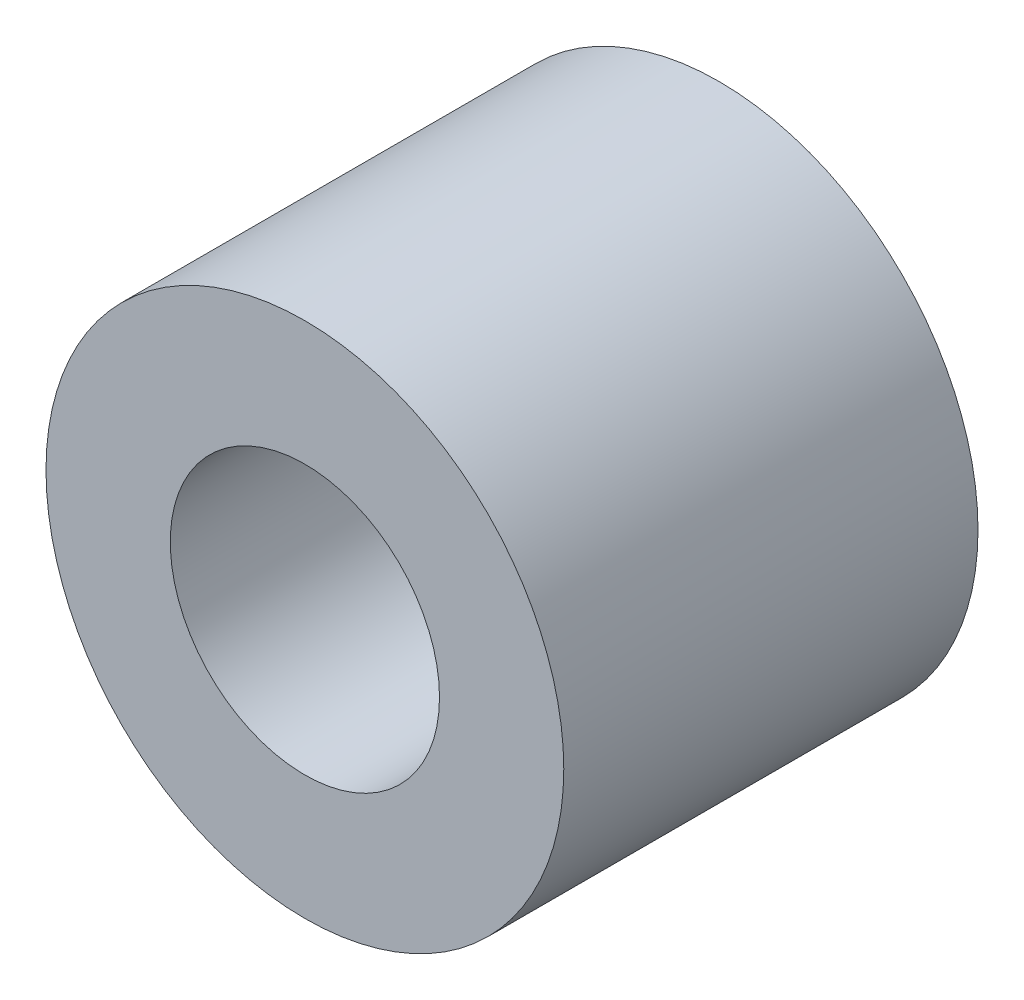
ISO-10303-21;
HEADER;
FILE_DESCRIPTION(('STEP AP214'),'2;1');
FILE_NAME('part.step','',(''),(''),'','','');
FILE_SCHEMA(('AUTOMOTIVE_DESIGN { 1 0 10303 214 1 1 1 1 }'));
ENDSEC;
DATA;
#1=APPLICATION_CONTEXT('core data for automotive mechanical design processes');
#2=APPLICATION_PROTOCOL_DEFINITION('international standard','automotive_design',2000,#1);
#3=PRODUCT_CONTEXT('',#1,'mechanical');
#4=PRODUCT('Part','Part','',(#3));
#5=PRODUCT_RELATED_PRODUCT_CATEGORY('part','',(#4));
#6=PRODUCT_DEFINITION_FORMATION('','',#4);
#7=PRODUCT_DEFINITION_CONTEXT('part definition',#1,'design');
#8=PRODUCT_DEFINITION('design','',#6,#7);
#9=PRODUCT_DEFINITION_SHAPE('','',#8);
#10=(LENGTH_UNIT() NAMED_UNIT(*) SI_UNIT(.MILLI.,.METRE.));
#11=(NAMED_UNIT(*) PLANE_ANGLE_UNIT() SI_UNIT($,.RADIAN.));
#12=(NAMED_UNIT(*) SI_UNIT($,.STERADIAN.) SOLID_ANGLE_UNIT());
#13=UNCERTAINTY_MEASURE_WITH_UNIT(LENGTH_MEASURE(1.E-05),#10,'distance_accuracy_value','');
#14=(GEOMETRIC_REPRESENTATION_CONTEXT(3) GLOBAL_UNCERTAINTY_ASSIGNED_CONTEXT((#13)) GLOBAL_UNIT_ASSIGNED_CONTEXT((#10,
#11,#12)) REPRESENTATION_CONTEXT('',''));
#15=CARTESIAN_POINT('',(0.,0.,0.));
#16=DIRECTION('',(0.,0.,1.));
#17=DIRECTION('',(1.,0.,0.));
#18=AXIS2_PLACEMENT_3D('',#15,#16,#17);
#19=CARTESIAN_POINT('',(0.,0.,5.08));
#20=DIRECTION('',(0.,0.,1.));
#21=DIRECTION('',(1.,0.,0.));
#22=AXIS2_PLACEMENT_3D('',#19,#20,#21);
#23=PLANE('',#22);
#24=CARTESIAN_POINT('',(0.,0.,5.08));
#25=DIRECTION('',(0.,0.,1.));
#26=DIRECTION('',(1.,0.,0.));
#27=AXIS2_PLACEMENT_3D('',#24,#25,#26);
#28=CIRCLE('',#27,3.175);
#29=CARTESIAN_POINT('',(3.175,0.,5.08));
#30=VERTEX_POINT('',#29);
#31=EDGE_CURVE('E10',#30,#30,#28,.T.);
#32=ORIENTED_EDGE('',*,*,#31,.T.);
#33=EDGE_LOOP('',(#32));
#34=FACE_BOUND('',#33,.T.);
#35=CARTESIAN_POINT('',(0.,0.,5.08));
#36=DIRECTION('',(0.,0.,1.));
#37=DIRECTION('',(1.,0.,0.));
#38=AXIS2_PLACEMENT_3D('',#35,#36,#37);
#39=CIRCLE('',#38,1.651);
#40=CARTESIAN_POINT('',(1.651,0.,5.08));
#41=VERTEX_POINT('',#40);
#42=EDGE_CURVE('E41',#41,#41,#39,.T.);
#43=ORIENTED_EDGE('',*,*,#42,.F.);
#44=EDGE_LOOP('',(#43));
#45=FACE_BOUND('',#44,.T.);
#46=ADVANCED_FACE('F30',(#34,#45),#23,.T.);
#47=CARTESIAN_POINT('',(0.,0.,0.));
#48=DIRECTION('',(0.,0.,1.));
#49=DIRECTION('',(1.,0.,0.));
#50=AXIS2_PLACEMENT_3D('',#47,#48,#49);
#51=PLANE('',#50);
#52=CARTESIAN_POINT('',(0.,0.,0.));
#53=DIRECTION('',(0.,0.,1.));
#54=DIRECTION('',(1.,0.,0.));
#55=AXIS2_PLACEMENT_3D('',#52,#53,#54);
#56=CIRCLE('',#55,3.175);
#57=CARTESIAN_POINT('',(3.175,0.,0.));
#58=VERTEX_POINT('',#57);
#59=EDGE_CURVE('E34',#58,#58,#56,.T.);
#60=ORIENTED_EDGE('',*,*,#59,.F.);
#61=EDGE_LOOP('',(#60));
#62=FACE_BOUND('',#61,.T.);
#63=CARTESIAN_POINT('',(0.,0.,0.));
#64=DIRECTION('',(0.,0.,1.));
#65=DIRECTION('',(1.,0.,0.));
#66=AXIS2_PLACEMENT_3D('',#63,#64,#65);
#67=CIRCLE('',#66,1.651);
#68=CARTESIAN_POINT('',(1.651,0.,0.));
#69=VERTEX_POINT('',#68);
#70=EDGE_CURVE('E43',#69,#69,#67,.T.);
#71=ORIENTED_EDGE('',*,*,#70,.T.);
#72=EDGE_LOOP('',(#71));
#73=FACE_BOUND('',#72,.T.);
#74=ADVANCED_FACE('F53',(#62,#73),#51,.F.);
#75=CARTESIAN_POINT('',(0.,0.,5.08));
#76=DIRECTION('',(0.,0.,-1.));
#77=DIRECTION('',(-1.,0.,0.));
#78=AXIS2_PLACEMENT_3D('',#75,#76,#77);
#79=CYLINDRICAL_SURFACE('',#78,3.175);
#80=ORIENTED_EDGE('',*,*,#31,.F.);
#81=EDGE_LOOP('',(#80));
#82=FACE_BOUND('',#81,.T.);
#83=ORIENTED_EDGE('',*,*,#59,.T.);
#84=EDGE_LOOP('',(#83));
#85=FACE_BOUND('',#84,.T.);
#86=ADVANCED_FACE('F32',(#82,#85),#79,.T.);
#87=CARTESIAN_POINT('',(0.,0.,5.08));
#88=DIRECTION('',(0.,0.,-1.));
#89=DIRECTION('',(-1.,0.,0.));
#90=AXIS2_PLACEMENT_3D('',#87,#88,#89);
#91=CYLINDRICAL_SURFACE('',#90,1.651);
#92=ORIENTED_EDGE('',*,*,#42,.T.);
#93=EDGE_LOOP('',(#92));
#94=FACE_BOUND('',#93,.T.);
#95=ORIENTED_EDGE('',*,*,#70,.F.);
#96=EDGE_LOOP('',(#95));
#97=FACE_BOUND('',#96,.T.);
#98=ADVANCED_FACE('F49',(#94,#97),#91,.F.);
#99=CLOSED_SHELL('',(#46,#74,#86,#98));
#100=MANIFOLD_SOLID_BREP('B2',#99);
#101=ADVANCED_BREP_SHAPE_REPRESENTATION('',(#18,#100),#14);
#102=SHAPE_DEFINITION_REPRESENTATION(#9,#101);
ENDSEC;
END-ISO-10303-21;
